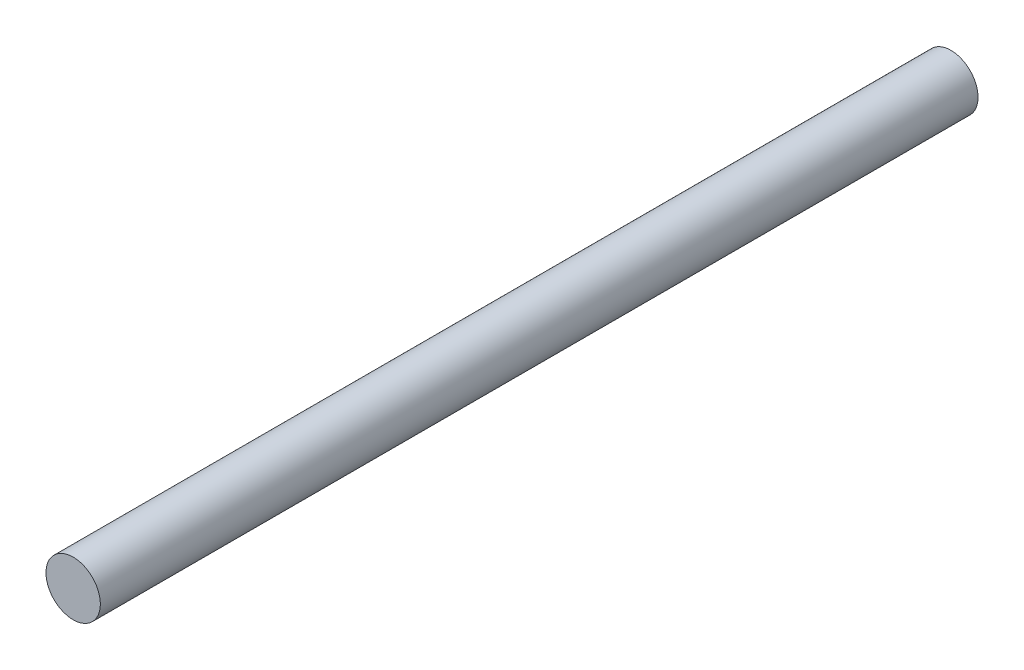
ISO-10303-21;
HEADER;
FILE_DESCRIPTION(('STEP AP214'),'2;1');
FILE_NAME('part.step','',(''),(''),'','','');
FILE_SCHEMA(('AUTOMOTIVE_DESIGN { 1 0 10303 214 1 1 1 1 }'));
ENDSEC;
DATA;
#1=APPLICATION_CONTEXT('core data for automotive mechanical design processes');
#2=APPLICATION_PROTOCOL_DEFINITION('international standard','automotive_design',2000,#1);
#3=PRODUCT_CONTEXT('',#1,'mechanical');
#4=PRODUCT('Part','Part','',(#3));
#5=PRODUCT_RELATED_PRODUCT_CATEGORY('part','',(#4));
#6=PRODUCT_DEFINITION_FORMATION('','',#4);
#7=PRODUCT_DEFINITION_CONTEXT('part definition',#1,'design');
#8=PRODUCT_DEFINITION('design','',#6,#7);
#9=PRODUCT_DEFINITION_SHAPE('','',#8);
#10=(LENGTH_UNIT() NAMED_UNIT(*) SI_UNIT(.MILLI.,.METRE.));
#11=(NAMED_UNIT(*) PLANE_ANGLE_UNIT() SI_UNIT($,.RADIAN.));
#12=(NAMED_UNIT(*) SI_UNIT($,.STERADIAN.) SOLID_ANGLE_UNIT());
#13=UNCERTAINTY_MEASURE_WITH_UNIT(LENGTH_MEASURE(1.E-05),#10,'distance_accuracy_value','');
#14=(GEOMETRIC_REPRESENTATION_CONTEXT(3) GLOBAL_UNCERTAINTY_ASSIGNED_CONTEXT((#13)) GLOBAL_UNIT_ASSIGNED_CONTEXT((#10,
#11,#12)) REPRESENTATION_CONTEXT('',''));
#15=CARTESIAN_POINT('',(0.,0.,0.));
#16=DIRECTION('',(0.,0.,1.));
#17=DIRECTION('',(1.,0.,0.));
#18=AXIS2_PLACEMENT_3D('',#15,#16,#17);
#19=CARTESIAN_POINT('',(0.,0.,304.8));
#20=DIRECTION('',(0.,0.,-1.));
#21=DIRECTION('',(-1.,0.,0.));
#22=AXIS2_PLACEMENT_3D('',#19,#20,#21);
#23=CYLINDRICAL_SURFACE('',#22,2.5);
#24=CARTESIAN_POINT('',(0.,0.,0.));
#25=DIRECTION('',(0.,0.,1.));
#26=DIRECTION('',(1.,0.,0.));
#27=AXIS2_PLACEMENT_3D('',#24,#25,#26);
#28=CIRCLE('',#27,2.5);
#29=CARTESIAN_POINT('',(-2.5,0.,0.));
#30=VERTEX_POINT('',#29);
#31=EDGE_CURVE('E10',#30,#30,#28,.T.);
#32=CARTESIAN_POINT('',(0.,0.,80.8));
#33=DIRECTION('',(0.,0.,1.));
#34=DIRECTION('',(1.,0.,0.));
#35=AXIS2_PLACEMENT_3D('',#32,#33,#34);
#36=CIRCLE('',#35,2.5);
#37=CARTESIAN_POINT('',(-2.5,0.,80.8));
#38=VERTEX_POINT('',#37);
#39=EDGE_CURVE('E44',#38,#38,#36,.T.);
#40=CARTESIAN_POINT('',(-2.5,0.,0.));
#41=CARTESIAN_POINT('',(-2.5,0.,0.841666666666666));
#42=CARTESIAN_POINT('',(-2.5,0.,1.68333333333333));
#43=CARTESIAN_POINT('',(-2.5,0.,3.36666666666667));
#44=CARTESIAN_POINT('',(-2.5,0.,4.20833333333333));
#45=CARTESIAN_POINT('',(-2.5,0.,5.89166666666667));
#46=CARTESIAN_POINT('',(-2.5,0.,6.73333333333333));
#47=CARTESIAN_POINT('',(-2.5,0.,8.41666666666666));
#48=CARTESIAN_POINT('',(-2.5,0.,9.25833333333333));
#49=CARTESIAN_POINT('',(-2.5,0.,10.9416666666667));
#50=CARTESIAN_POINT('',(-2.5,0.,11.7833333333333));
#51=CARTESIAN_POINT('',(-2.5,0.,13.4666666666667));
#52=CARTESIAN_POINT('',(-2.5,0.,14.3083333333333));
#53=CARTESIAN_POINT('',(-2.5,0.,15.9916666666667));
#54=CARTESIAN_POINT('',(-2.5,0.,16.8333333333333));
#55=CARTESIAN_POINT('',(-2.5,0.,18.5166666666667));
#56=CARTESIAN_POINT('',(-2.5,0.,19.3583333333333));
#57=CARTESIAN_POINT('',(-2.5,0.,21.0416666666667));
#58=CARTESIAN_POINT('',(-2.5,0.,21.8833333333333));
#59=CARTESIAN_POINT('',(-2.5,0.,23.5666666666667));
#60=CARTESIAN_POINT('',(-2.5,0.,24.4083333333333));
#61=CARTESIAN_POINT('',(-2.5,0.,26.0916666666667));
#62=CARTESIAN_POINT('',(-2.5,0.,26.9333333333333));
#63=CARTESIAN_POINT('',(-2.5,0.,28.6166666666667));
#64=CARTESIAN_POINT('',(-2.5,0.,29.4583333333333));
#65=CARTESIAN_POINT('',(-2.5,0.,31.1416666666667));
#66=CARTESIAN_POINT('',(-2.5,0.,31.9833333333333));
#67=CARTESIAN_POINT('',(-2.5,0.,33.6666666666667));
#68=CARTESIAN_POINT('',(-2.5,0.,34.5083333333333));
#69=CARTESIAN_POINT('',(-2.5,0.,36.1916666666667));
#70=CARTESIAN_POINT('',(-2.5,0.,37.0333333333333));
#71=CARTESIAN_POINT('',(-2.5,0.,38.7166666666667));
#72=CARTESIAN_POINT('',(-2.5,0.,39.5583333333333));
#73=CARTESIAN_POINT('',(-2.5,0.,41.2416666666667));
#74=CARTESIAN_POINT('',(-2.5,0.,42.0833333333333));
#75=CARTESIAN_POINT('',(-2.5,0.,43.7666666666667));
#76=CARTESIAN_POINT('',(-2.5,0.,44.6083333333333));
#77=CARTESIAN_POINT('',(-2.5,0.,46.2916666666667));
#78=CARTESIAN_POINT('',(-2.5,0.,47.1333333333334));
#79=CARTESIAN_POINT('',(-2.5,0.,48.8166666666667));
#80=CARTESIAN_POINT('',(-2.5,0.,49.6583333333334));
#81=CARTESIAN_POINT('',(-2.5,0.,51.3416666666667));
#82=CARTESIAN_POINT('',(-2.5,0.,52.1833333333334));
#83=CARTESIAN_POINT('',(-2.5,0.,53.8666666666667));
#84=CARTESIAN_POINT('',(-2.5,0.,54.7083333333334));
#85=CARTESIAN_POINT('',(-2.5,0.,56.3916666666667));
#86=CARTESIAN_POINT('',(-2.5,0.,57.2333333333333));
#87=CARTESIAN_POINT('',(-2.5,0.,58.9166666666667));
#88=CARTESIAN_POINT('',(-2.5,0.,59.7583333333334));
#89=CARTESIAN_POINT('',(-2.5,0.,61.4416666666667));
#90=CARTESIAN_POINT('',(-2.5,0.,62.2833333333334));
#91=CARTESIAN_POINT('',(-2.5,0.,63.9666666666667));
#92=CARTESIAN_POINT('',(-2.5,0.,64.8083333333333));
#93=CARTESIAN_POINT('',(-2.5,0.,66.4916666666667));
#94=CARTESIAN_POINT('',(-2.5,0.,67.3333333333333));
#95=CARTESIAN_POINT('',(-2.5,0.,69.0166666666667));
#96=CARTESIAN_POINT('',(-2.5,0.,69.8583333333333));
#97=CARTESIAN_POINT('',(-2.5,0.,71.5416666666667));
#98=CARTESIAN_POINT('',(-2.5,0.,72.3833333333333));
#99=CARTESIAN_POINT('',(-2.5,0.,74.0666666666667));
#100=CARTESIAN_POINT('',(-2.5,0.,74.9083333333333));
#101=CARTESIAN_POINT('',(-2.5,0.,76.5916666666667));
#102=CARTESIAN_POINT('',(-2.5,0.,77.4333333333333));
#103=CARTESIAN_POINT('',(-2.5,0.,79.1166666666667));
#104=CARTESIAN_POINT('',(-2.5,0.,79.9583333333333));
#105=CARTESIAN_POINT('',(-2.5,0.,80.8));
#106=B_SPLINE_CURVE_WITH_KNOTS('',3,(#40,#41,#42,#43,#44,#45,#46,#47,#48,#49,#50,#51,#52,#53,
#54,#55,#56,#57,#58,#59,#60,#61,#62,#63,#64,#65,#66,#67,#68,#69,#70,#71,#72,#73,#74,#75,#76,#77,
#78,#79,#80,#81,#82,#83,#84,#85,#86,#87,#88,#89,#90,#91,#92,#93,#94,#95,#96,#97,#98,#99,#100,
#101,#102,#103,#104,#105),.UNSPECIFIED.,.F.,.F.,(4,2,2,2,2,2,2,2,2,2,2,2,2,2,2,2,2,2,2,2,2,2,2,
2,2,2,2,2,2,2,2,2,4),(0.,2.525,5.05,7.575,10.1,12.625,15.15,17.675,20.2,22.725,25.25,27.775,
30.3,32.825,35.35,37.875,40.4,42.925,45.45,47.975,50.5,53.025,55.55,58.075,60.6,63.125,65.65,
68.175,70.7,73.225,75.75,78.275,80.8),.UNSPECIFIED.);
#107=EDGE_CURVE('BSEAM37',#30,#38,#106,.T.);
#108=ORIENTED_EDGE('',*,*,#31,.T.);
#109=ORIENTED_EDGE('',*,*,#39,.F.);
#110=ORIENTED_EDGE('',*,*,#107,.T.);
#111=ORIENTED_EDGE('',*,*,#107,.F.);
#112=EDGE_LOOP('',(#108,#110,#109,#111));
#113=FACE_BOUND('',#112,.T.);
#114=ADVANCED_FACE('F37',(#113),#23,.T.);
#115=CARTESIAN_POINT('',(0.,0.,0.));
#116=DIRECTION('',(0.,0.,1.));
#117=DIRECTION('',(1.,0.,0.));
#118=AXIS2_PLACEMENT_3D('',#115,#116,#117);
#119=PLANE('',#118);
#120=ORIENTED_EDGE('',*,*,#31,.F.);
#121=EDGE_LOOP('',(#120));
#122=FACE_BOUND('',#121,.T.);
#123=ADVANCED_FACE('F54',(#122),#119,.F.);
#124=CARTESIAN_POINT('',(0.,0.,80.8));
#125=DIRECTION('',(0.,0.,1.));
#126=DIRECTION('',(1.,0.,0.));
#127=AXIS2_PLACEMENT_3D('',#124,#125,#126);
#128=PLANE('',#127);
#129=ORIENTED_EDGE('',*,*,#39,.T.);
#130=EDGE_LOOP('',(#129));
#131=FACE_BOUND('',#130,.T.);
#132=ADVANCED_FACE('F51',(#131),#128,.T.);
#133=CLOSED_SHELL('',(#114,#123,#132));
#134=MANIFOLD_SOLID_BREP('B2',#133);
#135=ADVANCED_BREP_SHAPE_REPRESENTATION('',(#18,#134),#14);
#136=SHAPE_DEFINITION_REPRESENTATION(#9,#135);
ENDSEC;
END-ISO-10303-21;
